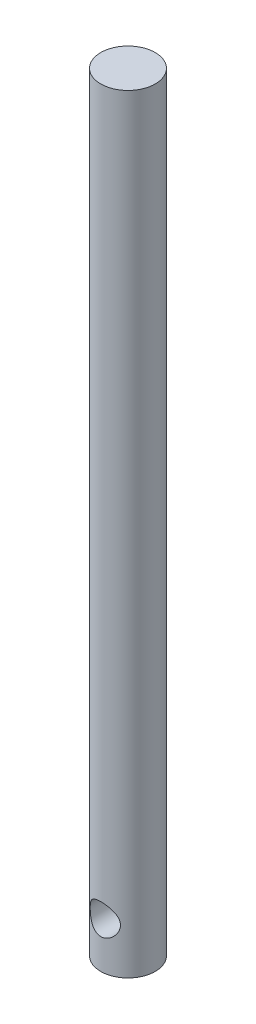
ISO-10303-21;
HEADER;
FILE_DESCRIPTION(('STEP AP214'),'2;1');
FILE_NAME('part.step','',(''),(''),'','','');
FILE_SCHEMA(('AUTOMOTIVE_DESIGN { 1 0 10303 214 1 1 1 1 }'));
ENDSEC;
DATA;
#1=APPLICATION_CONTEXT('core data for automotive mechanical design processes');
#2=APPLICATION_PROTOCOL_DEFINITION('international standard','automotive_design',2000,#1);
#3=PRODUCT_CONTEXT('',#1,'mechanical');
#4=PRODUCT('Part','Part','',(#3));
#5=PRODUCT_RELATED_PRODUCT_CATEGORY('part','',(#4));
#6=PRODUCT_DEFINITION_FORMATION('','',#4);
#7=PRODUCT_DEFINITION_CONTEXT('part definition',#1,'design');
#8=PRODUCT_DEFINITION('design','',#6,#7);
#9=PRODUCT_DEFINITION_SHAPE('','',#8);
#10=(LENGTH_UNIT() NAMED_UNIT(*) SI_UNIT(.MILLI.,.METRE.));
#11=(NAMED_UNIT(*) PLANE_ANGLE_UNIT() SI_UNIT($,.RADIAN.));
#12=(NAMED_UNIT(*) SI_UNIT($,.STERADIAN.) SOLID_ANGLE_UNIT());
#13=UNCERTAINTY_MEASURE_WITH_UNIT(LENGTH_MEASURE(1.E-05),#10,'distance_accuracy_value','');
#14=(GEOMETRIC_REPRESENTATION_CONTEXT(3) GLOBAL_UNCERTAINTY_ASSIGNED_CONTEXT((#13)) GLOBAL_UNIT_ASSIGNED_CONTEXT((#10,
#11,#12)) REPRESENTATION_CONTEXT('',''));
#15=CARTESIAN_POINT('',(0.,0.,0.));
#16=DIRECTION('',(0.,0.,1.));
#17=DIRECTION('',(1.,0.,0.));
#18=AXIS2_PLACEMENT_3D('',#15,#16,#17);
#19=CARTESIAN_POINT('',(32.6665114947379,254.,0.));
#20=DIRECTION('',(0.,-1.,0.));
#21=DIRECTION('',(0.,0.,-1.));
#22=AXIS2_PLACEMENT_3D('',#19,#20,#21);
#23=CYLINDRICAL_SURFACE('',#22,9.);
#24=CARTESIAN_POINT('',(32.6665114947379,20.,-9.));
#25=CARTESIAN_POINT('',(32.5367828446391,20.0000004034984,-9.00000035367436));
#26=CARTESIAN_POINT('',(32.4070594209438,19.9949457291585,-8.99718916475519));
#27=CARTESIAN_POINT('',(32.1485899390427,19.9747929956815,-8.98601661845687));
#28=CARTESIAN_POINT('',(32.0198442406236,19.9596914048975,-8.97765330942365));
#29=CARTESIAN_POINT('',(31.7643966779283,19.9196443065761,-8.95559163133401));
#30=CARTESIAN_POINT('',(31.6376942972219,19.8947013282714,-8.94189463304535));
#31=CARTESIAN_POINT('',(31.3871540239864,19.8352693657243,-8.90950110249539));
#32=CARTESIAN_POINT('',(31.2633173329788,19.800776453257,-8.89080251301058));
#33=CARTESIAN_POINT('',(31.0198672429261,19.7227988187131,-8.8489406066893));
#34=CARTESIAN_POINT('',(30.900238461846,19.6793519723011,-8.82579612337894));
#35=CARTESIAN_POINT('',(30.6653313414804,19.5838168431952,-8.77551906926369));
#36=CARTESIAN_POINT('',(30.5500546628547,19.5317253019913,-8.74838499507351));
#37=CARTESIAN_POINT('',(30.2117227207629,19.3631884503319,-8.66187363770961));
#38=CARTESIAN_POINT('',(29.9959773181274,19.2344198818942,-8.59735346727596));
#39=CARTESIAN_POINT('',(29.5737992038572,18.9378076863466,-8.45507241221886));
#40=CARTESIAN_POINT('',(29.3690573350959,18.7678695156046,-8.37670278285859));
#41=CARTESIAN_POINT('',(28.9893515052516,18.3983538741864,-8.21711406392093));
#42=CARTESIAN_POINT('',(28.814417956795,18.1987465168941,-8.13589216491854));
#43=CARTESIAN_POINT('',(28.4813435372587,17.7513058265881,-7.97009263226158));
#44=CARTESIAN_POINT('',(28.3267012137276,17.5006351634021,-7.88600912242673));
#45=CARTESIAN_POINT('',(28.1285911250821,17.1045411217027,-7.77258662819673));
#46=CARTESIAN_POINT('',(28.068200145882,16.9691734216196,-7.73689861013125));
#47=CARTESIAN_POINT('',(27.9593117336566,16.692446845762,-7.67113380801425));
#48=CARTESIAN_POINT('',(27.9108106837584,16.5510898073064,-7.64105531823258));
#49=CARTESIAN_POINT('',(27.8019930079091,16.1799943165465,-7.57250099477048));
#50=CARTESIAN_POINT('',(27.7510582166957,15.9464097803243,-7.53922489494339));
#51=CARTESIAN_POINT('',(27.6831418013948,15.4724996130238,-7.49451395010564));
#52=CARTESIAN_POINT('',(27.6661267085638,15.2321808643583,-7.4830575759562));
#53=CARTESIAN_POINT('',(27.6669098482661,14.7513456479218,-7.48358103631206));
#54=CARTESIAN_POINT('',(27.684746202541,14.5108292516151,-7.49558653424255));
#55=CARTESIAN_POINT('',(27.7543017973533,14.0368419240406,-7.54134329912878));
#56=CARTESIAN_POINT('',(27.8060430702343,13.8033756774211,-7.57510870603263));
#57=CARTESIAN_POINT('',(27.9409581753619,13.3491364552529,-7.65998850707494));
#58=CARTESIAN_POINT('',(28.0241389960293,13.1283663143898,-7.71110675816709));
#59=CARTESIAN_POINT('',(28.2191083189459,12.7031833464194,-7.82517266123029));
#60=CARTESIAN_POINT('',(28.3309079946434,12.4987769490986,-7.88812493091398));
#61=CARTESIAN_POINT('',(28.5995741096628,12.0791797137506,-8.03034742050394));
#62=CARTESIAN_POINT('',(28.7607072995741,11.8670704959665,-8.11064361563464));
#63=CARTESIAN_POINT('',(29.1146098011926,11.4709010721211,-8.2717439652866));
#64=CARTESIAN_POINT('',(29.307404079653,11.2868632247962,-8.3525484718906));
#65=CARTESIAN_POINT('',(29.6283081477755,11.0262203820365,-8.47255594770406));
#66=CARTESIAN_POINT('',(29.7466296846847,10.9384610971818,-8.51415799334353));
#67=CARTESIAN_POINT('',(29.9912929633343,10.7733031325161,-8.59416899062467));
#68=CARTESIAN_POINT('',(30.1176316146917,10.6959004958319,-8.63257915962083));
#69=CARTESIAN_POINT('',(30.3776007045459,10.5521979144297,-8.70511911408218));
#70=CARTESIAN_POINT('',(30.5112292314338,10.4858950774127,-8.73925001402194));
#71=CARTESIAN_POINT('',(30.7849303882085,10.3651304371239,-8.80223607285831));
#72=CARTESIAN_POINT('',(30.925002231321,10.31066719278,-8.83109187375265));
#73=CARTESIAN_POINT('',(31.2003965316157,10.2177299675468,-8.88080389711844));
#74=CARTESIAN_POINT('',(31.3353529234199,10.1783968460121,-8.90208189584858));
#75=CARTESIAN_POINT('',(31.60885690389,10.1111154382259,-8.9387020465349));
#76=CARTESIAN_POINT('',(31.747404020248,10.0831656626629,-8.95404497497797));
#77=CARTESIAN_POINT('',(32.0268233476822,10.0390736483573,-8.97833234249118));
#78=CARTESIAN_POINT('',(32.1676938837986,10.022923253825,-8.98728120107926));
#79=CARTESIAN_POINT('',(32.4505573972594,10.0026543866648,-8.99852157239254));
#80=CARTESIAN_POINT('',(32.5925502628185,9.99853473053409,-9.00081373995796));
#81=CARTESIAN_POINT('',(32.8601728052236,10.0021687734577,-8.99879540596083));
#82=CARTESIAN_POINT('',(32.9858278933045,10.0086261118927,-8.99520578290285));
#83=CARTESIAN_POINT('',(33.2360798324394,10.0309580369905,-8.98283315150499));
#84=CARTESIAN_POINT('',(33.3606763448662,10.0468355299366,-8.97404854042271));
#85=CARTESIAN_POINT('',(33.6078388152261,10.087812709104,-8.95149651046086));
#86=CARTESIAN_POINT('',(33.7304055129656,10.1129089544545,-8.93773095073358));
#87=CARTESIAN_POINT('',(33.9727582430043,10.1720288858661,-8.90554320996941));
#88=CARTESIAN_POINT('',(34.0925431840941,10.2060560129727,-8.88711923415739));
#89=CARTESIAN_POINT('',(34.4456184447404,10.3207136092338,-8.82561614200698));
#90=CARTESIAN_POINT('',(34.6738070237579,10.4141194967415,-8.77619255116919));
#91=CARTESIAN_POINT('',(35.1113995036009,10.6316601669243,-8.66450874935682));
#92=CARTESIAN_POINT('',(35.3207983571972,10.7558031726297,-8.60224510405811));
#93=CARTESIAN_POINT('',(35.7382410737732,11.0458219722926,-8.46272453532919));
#94=CARTESIAN_POINT('',(35.9439193244684,11.2146808556353,-8.38458363909744));
#95=CARTESIAN_POINT('',(36.3255930212739,11.5821867954545,-8.22520611371522));
#96=CARTESIAN_POINT('',(36.5015553912837,11.7808665865338,-8.14396615672224));
#97=CARTESIAN_POINT('',(36.8367497247646,12.2261230952558,-7.97793731767649));
#98=CARTESIAN_POINT('',(36.9925115437944,12.4755084812089,-7.89361512920966));
#99=CARTESIAN_POINT('',(37.2592704110739,13.001689370523,-7.74146523733296));
#100=CARTESIAN_POINT('',(37.370330773016,13.2784454094521,-7.67361425911824));
#101=CARTESIAN_POINT('',(37.5242892430379,13.7924339279546,-7.57683809208937));
#102=CARTESIAN_POINT('',(37.5765692144714,14.0258825344072,-7.54274744656531));
#103=CARTESIAN_POINT('',(37.64719001223,14.4998932849409,-7.49631291383467));
#104=CARTESIAN_POINT('',(37.6655647396964,14.7404480788371,-7.48394730481338));
#105=CARTESIAN_POINT('',(37.6673879113381,15.222043485471,-7.48272923894071));
#106=CARTESIAN_POINT('',(37.6507928750416,15.4630843302881,-7.49390605410459));
#107=CARTESIAN_POINT('',(37.5835442158987,15.9383360755629,-7.53819223511371));
#108=CARTESIAN_POINT('',(37.5328688443958,16.1725425149428,-7.57131560614076));
#109=CARTESIAN_POINT('',(37.4001016918351,16.627637340616,-7.65501053053173));
#110=CARTESIAN_POINT('',(37.3181048273591,16.8485636525451,-7.7055293237003));
#111=CARTESIAN_POINT('',(37.1254983471157,17.2742180217571,-7.81855933555385));
#112=CARTESIAN_POINT('',(37.0148777093441,17.4789397995025,-7.88107517147513));
#113=CARTESIAN_POINT('',(36.7489052842257,17.8991183375095,-8.02246926398218));
#114=CARTESIAN_POINT('',(36.5893248399498,18.1115438786473,-8.10239358916594));
#115=CARTESIAN_POINT('',(36.2385959921648,18.5086152041109,-8.26301218742008));
#116=CARTESIAN_POINT('',(36.0474220871526,18.6932383149827,-8.34370703244943));
#117=CARTESIAN_POINT('',(35.7287734770642,18.9552664708034,-8.46388232404898));
#118=CARTESIAN_POINT('',(35.6110560509239,19.0436910628916,-8.50565265713109));
#119=CARTESIAN_POINT('',(35.367560687459,19.2102335331473,-8.5860784208833));
#120=CARTESIAN_POINT('',(35.2417858314498,19.2883553167594,-8.62473502968511));
#121=CARTESIAN_POINT('',(34.982902640066,19.4335486508301,-8.69784009103003));
#122=CARTESIAN_POINT('',(34.8497967135447,19.5006238024406,-8.73228991401566));
#123=CARTESIAN_POINT('',(34.577079049447,19.6229922280432,-8.79598351699736));
#124=CARTESIAN_POINT('',(34.4374682281901,19.6782871553919,-8.82522802746501));
#125=CARTESIAN_POINT('',(34.1656401994188,19.7719363734518,-8.87524400995768));
#126=CARTESIAN_POINT('',(34.0338906745615,19.8113683212244,-8.89654158296884));
#127=CARTESIAN_POINT('',(33.7668494133089,19.8793680968185,-8.93349970483441));
#128=CARTESIAN_POINT('',(33.6315581519881,19.9079373738153,-8.94916100560194));
#129=CARTESIAN_POINT('',(33.3585998191711,19.953802009618,-8.97439622187978));
#130=CARTESIAN_POINT('',(33.2209342606779,19.9711042942135,-8.98397387690143));
#131=CARTESIAN_POINT('',(32.9443475932453,19.9942027849947,-8.99677541735904));
#132=CARTESIAN_POINT('',(32.8054265475917,19.9999995679289,-8.9999996212811));
#133=CARTESIAN_POINT('',(32.6665114947379,20.,-9.));
#134=B_SPLINE_CURVE_WITH_KNOTS('',3,(#24,#25,#26,#27,#28,#29,#30,#31,#32,#33,#34,#35,#36,#37,
#38,#39,#40,#41,#42,#43,#44,#45,#46,#47,#48,#49,#50,#51,#52,#53,#54,#55,#56,#57,#58,#59,#60,#61,
#62,#63,#64,#65,#66,#67,#68,#69,#70,#71,#72,#73,#74,#75,#76,#77,#78,#79,#80,#81,#82,#83,#84,#85,
#86,#87,#88,#89,#90,#91,#92,#93,#94,#95,#96,#97,#98,#99,#100,#101,#102,#103,#104,#105,#106,#107,
#108,#109,#110,#111,#112,#113,#114,#115,#116,#117,#118,#119,#120,#121,#122,#123,#124,#125,#126,
#127,#128,#129,#130,#131,#132,#133),.UNSPECIFIED.,.T.,.F.,(4,2,2,2,2,2,2,2,2,2,2,2,2,2,2,2,2,2,
2,2,2,2,2,2,2,2,2,2,2,2,2,2,2,2,2,2,2,2,2,2,2,2,2,2,2,2,2,2,2,2,2,2,2,2,4),(0.,
0.389049038673798,0.778234906423187,1.16732081864409,1.55656701401969,1.94419928087581,
2.33197799415703,3.10694003691381,3.93579164360748,4.76548390659346,5.67926108729745,
6.13607645300719,6.59275268424475,7.31346839098542,8.03347261109575,8.75426483810453,
9.47552592073735,10.1969474205328,10.9186510103256,11.7500289468904,12.5820656531714,
13.0407937204137,13.4993460219526,13.9577786509196,14.4161554498582,14.8420733324614,
15.2679354732485,15.6935029768355,16.1190286145522,16.496186859017,16.8734615239821,
17.2505955151925,17.6278750290087,18.3788772686742,19.1300806397395,19.9587345054796,
20.7883047338674,21.7014293455293,22.613256047122,23.335047084232,24.0561160257528,
24.778082054147,25.5005092490547,26.220764350684,26.9412972109113,27.7704094124313,
28.6001941523198,29.0588132846799,29.5172580673312,29.9755531019594,30.4337837723652,
30.8507153459595,31.2675912777014,31.6842107144439,32.1008092663359),.UNSPECIFIED.);
#135=CARTESIAN_POINT('',(32.6665114947379,20.,-9.));
#136=VERTEX_POINT('',#135);
#137=EDGE_CURVE('E45',#136,#136,#134,.T.);
#138=ORIENTED_EDGE('',*,*,#137,.T.);
#139=EDGE_LOOP('',(#138));
#140=FACE_BOUND('',#139,.T.);
#141=CARTESIAN_POINT('',(37.6665114947379,15.,7.48331477354789));
#142=CARTESIAN_POINT('',(37.6665131808659,14.8720718292849,7.48331243270645));
#143=CARTESIAN_POINT('',(37.661596053032,14.7441618676988,7.48660574987457));
#144=CARTESIAN_POINT('',(37.6420106872778,14.4893789572325,7.49963659714171));
#145=CARTESIAN_POINT('',(37.6273394247641,14.3625063423729,7.50937612609856));
#146=CARTESIAN_POINT('',(37.588442609149,14.1107082480239,7.53492756878943));
#147=CARTESIAN_POINT('',(37.564206021254,13.9857851912361,7.55074649531046));
#148=CARTESIAN_POINT('',(37.5065224721387,13.7388925149792,7.58784959281152));
#149=CARTESIAN_POINT('',(37.4730713735123,13.6169242490683,7.60913621855172));
#150=CARTESIAN_POINT('',(37.3599961925678,13.2582612525193,7.67978574183441));
#151=CARTESIAN_POINT('',(37.2673491845615,13.0269127051961,7.73614928485831));
#152=CARTESIAN_POINT('',(37.0506316556802,12.5832658302234,7.8609828997943));
#153=CARTESIAN_POINT('',(36.9265541551692,12.3709717481181,7.92945565972794));
#154=CARTESIAN_POINT('',(36.6355209117743,11.9471854751309,8.07938439169734));
#155=CARTESIAN_POINT('',(36.4654600344027,11.7380410446313,8.16145087575439));
#156=CARTESIAN_POINT('',(36.0935478330022,11.3492791212117,8.32445651504934));
#157=CARTESIAN_POINT('',(35.8916771878194,11.1696797102486,8.40539495238047));
#158=CARTESIAN_POINT('',(35.5581817022082,10.9183398980794,8.5237245436681));
#159=CARTESIAN_POINT('',(35.4364192536679,10.834720878775,8.56416494780396));
#160=CARTESIAN_POINT('',(35.1851444946628,10.6781514174861,8.64139626557984));
#161=CARTESIAN_POINT('',(35.0556353743742,10.6051966258869,8.67818866514922));
#162=CARTESIAN_POINT('',(34.7896713787858,10.4707182531401,8.74706012051628));
#163=CARTESIAN_POINT('',(34.653218971502,10.4091906458229,8.77914083555733));
#164=CARTESIAN_POINT('',(34.374286825375,10.298296411558,8.83763516885212));
#165=CARTESIAN_POINT('',(34.2318079111679,10.2489281270585,8.86404955947242));
#166=CARTESIAN_POINT('',(33.9542408233492,10.166688403985,8.90841219292351));
#167=CARTESIAN_POINT('',(33.819544964446,10.132775729582,8.92688709925996));
#168=CARTESIAN_POINT('',(33.5471418826589,10.0761971886586,8.95786090893054));
#169=CARTESIAN_POINT('',(33.4094350371113,10.053529921205,8.97036055664496));
#170=CARTESIAN_POINT('',(33.1322666453844,10.019784034152,8.9890129247515));
#171=CARTESIAN_POINT('',(32.9928062309833,10.0086982927845,8.99516954559615));
#172=CARTESIAN_POINT('',(32.7133162620534,9.99826429303817,9.00096328235762));
#173=CARTESIAN_POINT('',(32.573286754811,9.99891507862174,9.00060092929895));
#174=CARTESIAN_POINT('',(32.3089221195719,10.0112406041568,8.9937589730659));
#175=CARTESIAN_POINT('',(32.1845123553502,10.0217271857681,8.98793869928273));
#176=CARTESIAN_POINT('',(31.9371203161667,10.0519173148915,8.97125208146431));
#177=CARTESIAN_POINT('',(31.814138494307,10.0716237102359,8.96038417831598));
#178=CARTESIAN_POINT('',(31.5705235629492,10.120018135391,8.933857624232));
#179=CARTESIAN_POINT('',(31.4498896783165,10.1487031457372,8.91820058390017));
#180=CARTESIAN_POINT('',(31.2116728574801,10.2147363131196,8.88245387233266));
#181=CARTESIAN_POINT('',(31.0940911178503,10.2520878124226,8.86236249112146));
#182=CARTESIAN_POINT('',(30.7446938649011,10.3774329991721,8.79562517969765));
#183=CARTESIAN_POINT('',(30.5185097897412,10.4782582422032,8.74277577170477));
#184=CARTESIAN_POINT('',(30.0859721867101,10.7103343790074,8.62503641093523));
#185=CARTESIAN_POINT('',(29.8796249167854,10.8415948299534,8.5601426773154));
#186=CARTESIAN_POINT('',(29.4683309470523,11.1471840738587,8.41570683408599));
#187=CARTESIAN_POINT('',(29.2659997345824,11.3246512933881,8.33533893661064));
#188=CARTESIAN_POINT('',(28.8924371716992,11.709337300475,8.1730018262765));
#189=CARTESIAN_POINT('',(28.7212391383363,11.9165875406843,8.09103100070489));
#190=CARTESIAN_POINT('',(28.3991706456088,12.3778412005397,7.92624804992579));
#191=CARTESIAN_POINT('',(28.2515536506977,12.6343804399138,7.84403433178348));
#192=CARTESIAN_POINT('',(28.064854271458,13.0386620441184,7.73498351899427));
#193=CARTESIAN_POINT('',(28.0084018721559,13.1766943506871,7.70100676332582));
#194=CARTESIAN_POINT('',(27.907735669793,13.4584477733661,7.63921059111262));
#195=CARTESIAN_POINT('',(27.8635134912322,13.6021649189073,7.61138696341208));
#196=CARTESIAN_POINT('',(27.7910135449908,13.8825101344798,7.56513200965961));
#197=CARTESIAN_POINT('',(27.7617445262618,14.0187878315539,7.54612808373361));
#198=CARTESIAN_POINT('',(27.7146333364957,14.2940409075964,7.51529770745305));
#199=CARTESIAN_POINT('',(27.696784437474,14.4330146484144,7.50346703130622));
#200=CARTESIAN_POINT('',(27.6728292168278,14.7123073824244,7.48754609042981));
#201=CARTESIAN_POINT('',(27.666713836233,14.8526252536778,7.48344985429394));
#202=CARTESIAN_POINT('',(27.6663190930433,15.1332752160405,7.48318633493305));
#203=CARTESIAN_POINT('',(27.6720383714743,15.273607303667,7.48701814133073));
#204=CARTESIAN_POINT('',(27.6934554105488,15.5318756649396,7.50125622905865));
#205=CARTESIAN_POINT('',(27.7075256293353,15.6500103202308,7.51058874586671));
#206=CARTESIAN_POINT('',(27.743930636772,15.8844730138793,7.53449812964601));
#207=CARTESIAN_POINT('',(27.7662679267109,16.0008004943462,7.54907658379326));
#208=CARTESIAN_POINT('',(27.8453061738946,16.3459518302373,7.59999895162264));
#209=CARTESIAN_POINT('',(27.914045106721,16.571079923426,7.6435381867759));
#210=CARTESIAN_POINT('',(28.0842942494419,17.0155320145019,7.74683834475779));
#211=CARTESIAN_POINT('',(28.1870392366945,17.2342335907062,7.80719429287903));
#212=CARTESIAN_POINT('',(28.4213938744319,17.652639792763,7.93705962571137));
#213=CARTESIAN_POINT('',(28.5530176142632,17.8523350774153,8.00657347173437));
#214=CARTESIAN_POINT('',(28.8661636449774,18.2609795546195,8.16042346556686));
#215=CARTESIAN_POINT('',(29.0523173283056,18.4661704504933,8.2453341921284));
#216=CARTESIAN_POINT('',(29.4571371510782,18.8440219318929,8.41116341865887));
#217=CARTESIAN_POINT('',(29.6758232334081,19.016662415256,8.49207942899204));
#218=CARTESIAN_POINT('',(30.0313437448364,19.2517752888497,8.60654459047302));
#219=CARTESIAN_POINT('',(30.1580387244354,19.3277627198003,8.64441160092824));
#220=CARTESIAN_POINT('',(30.4185972630404,19.4686446554243,8.71579527343903));
#221=CARTESIAN_POINT('',(30.5524575815334,19.5335441198692,8.74931387896152));
#222=CARTESIAN_POINT('',(30.8263980448298,19.6514741426194,8.8109982055522));
#223=CARTESIAN_POINT('',(30.9664744038746,19.7045118093882,8.83916713100797));
#224=CARTESIAN_POINT('',(31.2518311217727,19.7980423274824,8.88929967030503));
#225=CARTESIAN_POINT('',(31.3971106865265,19.8385370840486,8.91126422653184));
#226=CARTESIAN_POINT('',(31.6764390900604,19.9028704362582,8.94636750970624));
#227=CARTESIAN_POINT('',(31.8101085863344,19.9279927033615,8.96018108298179));
#228=CARTESIAN_POINT('',(32.07951954147,19.967289570254,8.98185367551307));
#229=CARTESIAN_POINT('',(32.2152607711146,19.9814653723358,8.98971334870684));
#230=CARTESIAN_POINT('',(32.4876049098197,19.9986599661008,8.99925276317403));
#231=CARTESIAN_POINT('',(32.6242074131205,20.0016836680006,9.00093522424297));
#232=CARTESIAN_POINT('',(32.8971307824358,19.9965430439312,8.99807967611155));
#233=CARTESIAN_POINT('',(33.0334516630167,19.9883793118986,8.99354199713608));
#234=CARTESIAN_POINT('',(33.2920811686771,19.9622530056097,8.97907835524008));
#235=CARTESIAN_POINT('',(33.4145195186381,19.9452666885291,8.96968964144521));
#236=CARTESIAN_POINT('',(33.6573701219692,19.9023900268389,8.94612300520264));
#237=CARTESIAN_POINT('',(33.777781733347,19.8764969145763,8.93194359414207));
#238=CARTESIAN_POINT('',(34.1347127187315,19.7858653440887,8.88267195984858));
#239=CARTESIAN_POINT('',(34.3671532949532,19.7081513439325,8.84083292190673));
#240=CARTESIAN_POINT('',(34.8228456889442,19.5181050792204,8.74108400233929));
#241=CARTESIAN_POINT('',(35.0455447422796,19.404719368837,8.68269129836171));
#242=CARTESIAN_POINT('',(35.4694741161648,19.1478778307882,8.5552586630217));
#243=CARTESIAN_POINT('',(35.6706959284894,19.0044101523577,8.48621453838248));
#244=CARTESIAN_POINT('',(36.070894939865,18.6722471689218,8.33433239933884));
#245=CARTESIAN_POINT('',(36.26688365449,18.4802309976141,8.25082429244305));
#246=CARTESIAN_POINT('',(36.5355451273271,18.170072684499,8.12652435608709));
#247=CARTESIAN_POINT('',(36.6209494184014,18.0628824609679,8.08521168619209));
#248=CARTESIAN_POINT('',(36.7829317779752,17.84145897559,8.00395385460267));
#249=CARTESIAN_POINT('',(36.8595082839068,17.7272244723415,7.9640089358849));
#250=CARTESIAN_POINT('',(37.0084347805576,17.4838441215351,7.88386707615332));
#251=CARTESIAN_POINT('',(37.080096735597,17.3542155939272,7.84385429718774));
#252=CARTESIAN_POINT('',(37.2120238574231,17.0881452807601,7.7681465397299));
#253=CARTESIAN_POINT('',(37.2722947577281,16.9517069667568,7.73244939230646));
#254=CARTESIAN_POINT('',(37.3806437299241,16.6730930632395,7.66687445970634));
#255=CARTESIAN_POINT('',(37.4287505399425,16.5309319337913,7.63698299789825));
#256=CARTESIAN_POINT('',(37.5122093242747,16.2417110340955,7.58430305235848));
#257=CARTESIAN_POINT('',(37.5475693166889,16.0946544070744,7.56151010469755));
#258=CARTESIAN_POINT('',(37.6060949947756,15.7908274166896,7.52341637226572));
#259=CARTESIAN_POINT('',(37.6287044132619,15.6339055107126,7.5084591340159));
#260=CARTESIAN_POINT('',(37.6589112195063,15.3179796228808,7.48841004941368));
#261=CARTESIAN_POINT('',(37.6665093993945,15.1589757513353,7.48331768250081));
#262=CARTESIAN_POINT('',(37.6665114947379,15.,7.48331477354789));
#263=B_SPLINE_CURVE_WITH_KNOTS('',3,(#141,#142,#143,#144,#145,#146,#147,#148,#149,#150,#151,
#152,#153,#154,#155,#156,#157,#158,#159,#160,#161,#162,#163,#164,#165,#166,#167,#168,#169,#170,
#171,#172,#173,#174,#175,#176,#177,#178,#179,#180,#181,#182,#183,#184,#185,#186,#187,#188,#189,
#190,#191,#192,#193,#194,#195,#196,#197,#198,#199,#200,#201,#202,#203,#204,#205,#206,#207,#208,
#209,#210,#211,#212,#213,#214,#215,#216,#217,#218,#219,#220,#221,#222,#223,#224,#225,#226,#227,
#228,#229,#230,#231,#232,#233,#234,#235,#236,#237,#238,#239,#240,#241,#242,#243,#244,#245,#246,
#247,#248,#249,#250,#251,#252,#253,#254,#255,#256,#257,#258,#259,#260,#261,#262),.UNSPECIFIED.,
.T.,.F.,(4,2,2,2,2,2,2,2,2,2,2,2,2,2,2,2,2,2,2,2,2,2,2,2,2,2,2,2,2,2,2,2,2,2,2,2,2,2,2,2,2,2,2,
2,2,2,2,2,2,2,2,2,2,2,2,2,2,2,2,2,4),(0.,0.383617262434556,0.767353533654932,1.15153379253866,
1.53588683411636,2.29887381256896,3.06203037306044,3.90401345702823,4.74650994436255,
5.20543330239272,5.66416895408678,6.12274267036475,6.58125383950371,7.00103463233334,
7.42076311645811,7.84023334691959,8.25966940820446,8.63418281341921,9.00881197544206,
9.38331528661349,9.75796326728324,10.5142082489873,11.2706910268593,12.1098131090736,
12.9498279570035,13.8660549484084,14.3243316832876,14.7822937995549,15.2036849882509,
15.6248276917814,16.0456451171919,16.4664142228104,16.8239929217894,17.1816798984961,
17.8966505229979,18.6411117273933,19.3859369498883,20.2516469645331,21.1178898770868,
21.5748932590507,22.0316916800074,22.4882156157593,22.9446701724715,23.3542362432264,
23.7637573233568,24.1730980717718,24.5824170892821,24.9538736149231,25.3254456695292,
26.0679180989854,26.8347832325739,27.6019510415397,28.4584307032008,28.8875063562192,
29.3166578418249,29.7763339243287,30.2357780158996,30.6941262921722,31.1521857495434,
31.6289303211718,32.1056497347289),.UNSPECIFIED.);
#264=CARTESIAN_POINT('',(37.6665114947379,15.,7.48331477354789));
#265=VERTEX_POINT('',#264);
#266=EDGE_CURVE('E10',#265,#265,#263,.T.);
#267=ORIENTED_EDGE('',*,*,#266,.T.);
#268=EDGE_LOOP('',(#267));
#269=FACE_BOUND('',#268,.T.);
#270=CARTESIAN_POINT('',(32.6665114947379,254.,0.));
#271=DIRECTION('',(0.,1.,0.));
#272=DIRECTION('',(0.,0.,1.));
#273=AXIS2_PLACEMENT_3D('',#270,#271,#272);
#274=CIRCLE('',#273,9.);
#275=CARTESIAN_POINT('',(32.6665114947379,254.,9.));
#276=VERTEX_POINT('',#275);
#277=EDGE_CURVE('E53',#276,#276,#274,.T.);
#278=ORIENTED_EDGE('',*,*,#277,.F.);
#279=EDGE_LOOP('',(#278));
#280=FACE_BOUND('',#279,.T.);
#281=CARTESIAN_POINT('',(32.6665114947379,0.,0.));
#282=DIRECTION('',(0.,1.,0.));
#283=DIRECTION('',(0.,0.,1.));
#284=AXIS2_PLACEMENT_3D('',#281,#282,#283);
#285=CIRCLE('',#284,9.);
#286=CARTESIAN_POINT('',(32.6665114947379,0.,9.));
#287=VERTEX_POINT('',#286);
#288=EDGE_CURVE('E57',#287,#287,#285,.T.);
#289=ORIENTED_EDGE('',*,*,#288,.T.);
#290=EDGE_LOOP('',(#289));
#291=FACE_BOUND('',#290,.T.);
#292=ADVANCED_FACE('F41',(#140,#269,#280,#291),#23,.T.);
#293=CARTESIAN_POINT('',(32.6665114947379,254.,0.));
#294=DIRECTION('',(0.,1.,0.));
#295=DIRECTION('',(0.,0.,1.));
#296=AXIS2_PLACEMENT_3D('',#293,#294,#295);
#297=PLANE('',#296);
#298=ORIENTED_EDGE('',*,*,#277,.T.);
#299=EDGE_LOOP('',(#298));
#300=FACE_BOUND('',#299,.T.);
#301=ADVANCED_FACE('F69',(#300),#297,.T.);
#302=CARTESIAN_POINT('',(32.6665114947379,0.,0.));
#303=DIRECTION('',(0.,1.,0.));
#304=DIRECTION('',(0.,0.,1.));
#305=AXIS2_PLACEMENT_3D('',#302,#303,#304);
#306=PLANE('',#305);
#307=ORIENTED_EDGE('',*,*,#288,.F.);
#308=EDGE_LOOP('',(#307));
#309=FACE_BOUND('',#308,.T.);
#310=ADVANCED_FACE('F67',(#309),#306,.F.);
#311=CARTESIAN_POINT('',(32.6665114947379,15.,-41.));
#312=DIRECTION('',(0.,0.,1.));
#313=DIRECTION('',(1.,0.,0.));
#314=AXIS2_PLACEMENT_3D('',#311,#312,#313);
#315=CYLINDRICAL_SURFACE('',#314,5.);
#316=ORIENTED_EDGE('',*,*,#266,.F.);
#317=EDGE_LOOP('',(#316));
#318=FACE_BOUND('',#317,.T.);
#319=ORIENTED_EDGE('',*,*,#137,.F.);
#320=EDGE_LOOP('',(#319));
#321=FACE_BOUND('',#320,.T.);
#322=ADVANCED_FACE('F63',(#318,#321),#315,.F.);
#323=CLOSED_SHELL('',(#292,#301,#310,#322));
#324=MANIFOLD_SOLID_BREP('B2',#323);
#325=ADVANCED_BREP_SHAPE_REPRESENTATION('',(#18,#324),#14);
#326=SHAPE_DEFINITION_REPRESENTATION(#9,#325);
ENDSEC;
END-ISO-10303-21;
